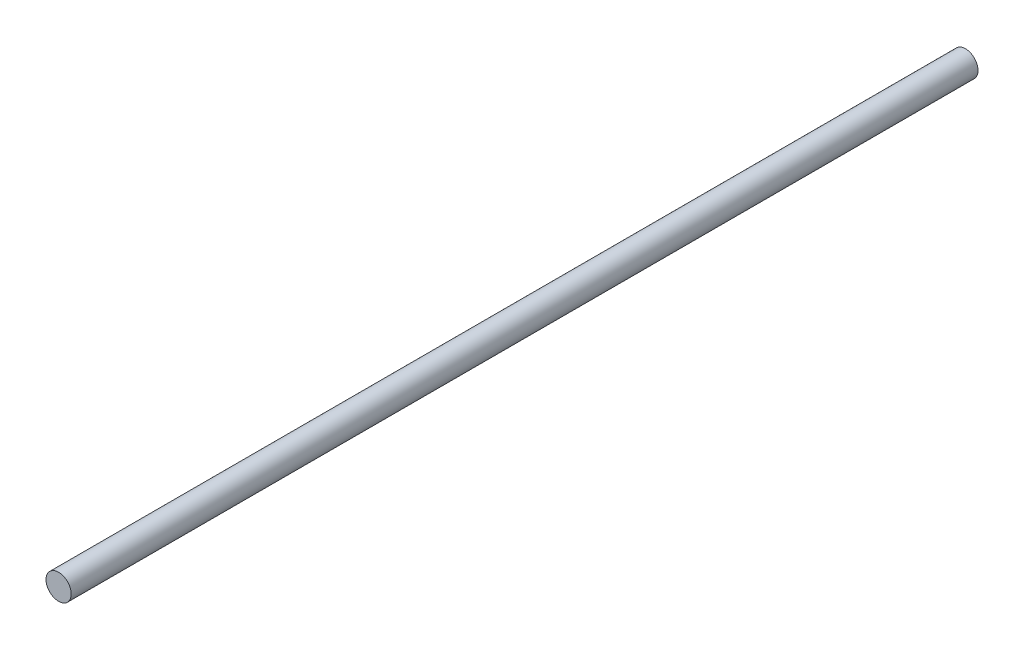
ISO-10303-21;
HEADER;
FILE_DESCRIPTION(('STEP AP214'),'2;1');
FILE_NAME('part.step','',(''),(''),'','','');
FILE_SCHEMA(('AUTOMOTIVE_DESIGN { 1 0 10303 214 1 1 1 1 }'));
ENDSEC;
DATA;
#1=APPLICATION_CONTEXT('core data for automotive mechanical design processes');
#2=APPLICATION_PROTOCOL_DEFINITION('international standard','automotive_design',2000,#1);
#3=PRODUCT_CONTEXT('',#1,'mechanical');
#4=PRODUCT('Part','Part','',(#3));
#5=PRODUCT_RELATED_PRODUCT_CATEGORY('part','',(#4));
#6=PRODUCT_DEFINITION_FORMATION('','',#4);
#7=PRODUCT_DEFINITION_CONTEXT('part definition',#1,'design');
#8=PRODUCT_DEFINITION('design','',#6,#7);
#9=PRODUCT_DEFINITION_SHAPE('','',#8);
#10=(LENGTH_UNIT() NAMED_UNIT(*) SI_UNIT(.MILLI.,.METRE.));
#11=(NAMED_UNIT(*) PLANE_ANGLE_UNIT() SI_UNIT($,.RADIAN.));
#12=(NAMED_UNIT(*) SI_UNIT($,.STERADIAN.) SOLID_ANGLE_UNIT());
#13=UNCERTAINTY_MEASURE_WITH_UNIT(LENGTH_MEASURE(1.E-05),#10,'distance_accuracy_value','');
#14=(GEOMETRIC_REPRESENTATION_CONTEXT(3) GLOBAL_UNCERTAINTY_ASSIGNED_CONTEXT((#13)) GLOBAL_UNIT_ASSIGNED_CONTEXT((#10,
#11,#12)) REPRESENTATION_CONTEXT('',''));
#15=CARTESIAN_POINT('',(0.,0.,0.));
#16=DIRECTION('',(0.,0.,1.));
#17=DIRECTION('',(1.,0.,0.));
#18=AXIS2_PLACEMENT_3D('',#15,#16,#17);
#19=CARTESIAN_POINT('',(0.,0.,360.));
#20=DIRECTION('',(0.,0.,-1.));
#21=DIRECTION('',(-1.,0.,0.));
#22=AXIS2_PLACEMENT_3D('',#19,#20,#21);
#23=CYLINDRICAL_SURFACE('',#22,5.);
#24=CARTESIAN_POINT('',(0.,0.,360.));
#25=DIRECTION('',(0.,0.,1.));
#26=DIRECTION('',(1.,0.,0.));
#27=AXIS2_PLACEMENT_3D('',#24,#25,#26);
#28=CIRCLE('',#27,5.);
#29=CARTESIAN_POINT('',(-5.,0.,360.));
#30=VERTEX_POINT('',#29);
#31=EDGE_CURVE('E10',#30,#30,#28,.T.);
#32=CARTESIAN_POINT('',(0.,0.,0.));
#33=DIRECTION('',(0.,0.,1.));
#34=DIRECTION('',(1.,0.,0.));
#35=AXIS2_PLACEMENT_3D('',#32,#33,#34);
#36=CIRCLE('',#35,5.);
#37=CARTESIAN_POINT('',(-5.,0.,0.));
#38=VERTEX_POINT('',#37);
#39=EDGE_CURVE('E34',#38,#38,#36,.T.);
#40=CARTESIAN_POINT('',(-5.,0.,360.));
#41=CARTESIAN_POINT('',(-5.,0.,356.25));
#42=CARTESIAN_POINT('',(-5.,0.,352.5));
#43=CARTESIAN_POINT('',(-5.,0.,345.));
#44=CARTESIAN_POINT('',(-5.,0.,341.25));
#45=CARTESIAN_POINT('',(-5.,0.,333.75));
#46=CARTESIAN_POINT('',(-5.,0.,330.));
#47=CARTESIAN_POINT('',(-5.,0.,322.5));
#48=CARTESIAN_POINT('',(-5.,0.,318.75));
#49=CARTESIAN_POINT('',(-5.,0.,311.25));
#50=CARTESIAN_POINT('',(-5.,0.,307.5));
#51=CARTESIAN_POINT('',(-5.,0.,300.));
#52=CARTESIAN_POINT('',(-5.,0.,296.25));
#53=CARTESIAN_POINT('',(-5.,0.,288.75));
#54=CARTESIAN_POINT('',(-5.,0.,285.));
#55=CARTESIAN_POINT('',(-5.,0.,277.5));
#56=CARTESIAN_POINT('',(-5.,0.,273.75));
#57=CARTESIAN_POINT('',(-5.,0.,266.25));
#58=CARTESIAN_POINT('',(-5.,0.,262.5));
#59=CARTESIAN_POINT('',(-5.,0.,255.));
#60=CARTESIAN_POINT('',(-5.,0.,251.25));
#61=CARTESIAN_POINT('',(-5.,0.,243.75));
#62=CARTESIAN_POINT('',(-5.,0.,240.));
#63=CARTESIAN_POINT('',(-5.,0.,232.5));
#64=CARTESIAN_POINT('',(-5.,0.,228.75));
#65=CARTESIAN_POINT('',(-5.,0.,221.25));
#66=CARTESIAN_POINT('',(-5.,0.,217.5));
#67=CARTESIAN_POINT('',(-5.,0.,210.));
#68=CARTESIAN_POINT('',(-5.,0.,206.25));
#69=CARTESIAN_POINT('',(-5.,0.,198.75));
#70=CARTESIAN_POINT('',(-5.,0.,195.));
#71=CARTESIAN_POINT('',(-5.,0.,187.5));
#72=CARTESIAN_POINT('',(-5.,0.,183.75));
#73=CARTESIAN_POINT('',(-5.,0.,176.25));
#74=CARTESIAN_POINT('',(-5.,0.,172.5));
#75=CARTESIAN_POINT('',(-5.,0.,165.));
#76=CARTESIAN_POINT('',(-5.,0.,161.25));
#77=CARTESIAN_POINT('',(-5.,0.,153.75));
#78=CARTESIAN_POINT('',(-5.,0.,150.));
#79=CARTESIAN_POINT('',(-5.,0.,142.5));
#80=CARTESIAN_POINT('',(-5.,0.,138.75));
#81=CARTESIAN_POINT('',(-5.,0.,131.25));
#82=CARTESIAN_POINT('',(-5.,0.,127.5));
#83=CARTESIAN_POINT('',(-5.,0.,120.));
#84=CARTESIAN_POINT('',(-5.,0.,116.25));
#85=CARTESIAN_POINT('',(-5.,0.,108.75));
#86=CARTESIAN_POINT('',(-5.,0.,105.));
#87=CARTESIAN_POINT('',(-5.,0.,97.5));
#88=CARTESIAN_POINT('',(-5.,0.,93.75));
#89=CARTESIAN_POINT('',(-5.,0.,86.25));
#90=CARTESIAN_POINT('',(-5.,0.,82.4999999999999));
#91=CARTESIAN_POINT('',(-5.,0.,74.9999999999999));
#92=CARTESIAN_POINT('',(-5.,0.,71.2499999999999));
#93=CARTESIAN_POINT('',(-5.,0.,63.75));
#94=CARTESIAN_POINT('',(-5.,0.,60.));
#95=CARTESIAN_POINT('',(-5.,0.,52.5));
#96=CARTESIAN_POINT('',(-5.,0.,48.7499999999999));
#97=CARTESIAN_POINT('',(-5.,0.,41.2499999999999));
#98=CARTESIAN_POINT('',(-5.,0.,37.4999999999999));
#99=CARTESIAN_POINT('',(-5.,0.,30.));
#100=CARTESIAN_POINT('',(-5.,0.,26.25));
#101=CARTESIAN_POINT('',(-5.,0.,18.75));
#102=CARTESIAN_POINT('',(-5.,0.,14.9999999999999));
#103=CARTESIAN_POINT('',(-5.,0.,7.49999999999993));
#104=CARTESIAN_POINT('',(-5.,0.,3.74999999999994));
#105=CARTESIAN_POINT('',(-5.,0.,0.));
#106=B_SPLINE_CURVE_WITH_KNOTS('',3,(#40,#41,#42,#43,#44,#45,#46,#47,#48,#49,#50,#51,#52,#53,
#54,#55,#56,#57,#58,#59,#60,#61,#62,#63,#64,#65,#66,#67,#68,#69,#70,#71,#72,#73,#74,#75,#76,#77,
#78,#79,#80,#81,#82,#83,#84,#85,#86,#87,#88,#89,#90,#91,#92,#93,#94,#95,#96,#97,#98,#99,#100,
#101,#102,#103,#104,#105),.UNSPECIFIED.,.F.,.F.,(4,2,2,2,2,2,2,2,2,2,2,2,2,2,2,2,2,2,2,2,2,2,2,
2,2,2,2,2,2,2,2,2,4),(0.,11.25,22.5,33.7499999999999,45.,56.25,67.4999999999999,78.75,90.,
101.25,112.5,123.75,135.,146.25,157.5,168.75,180.,191.25,202.5,213.75,225.,236.25,247.5,258.75,
270.,281.25,292.5,303.75,315.,326.25,337.5,348.75,360.),.UNSPECIFIED.);
#107=EDGE_CURVE('BSEAM31',#30,#38,#106,.T.);
#108=ORIENTED_EDGE('',*,*,#31,.F.);
#109=ORIENTED_EDGE('',*,*,#39,.T.);
#110=ORIENTED_EDGE('',*,*,#107,.T.);
#111=ORIENTED_EDGE('',*,*,#107,.F.);
#112=EDGE_LOOP('',(#108,#110,#109,#111));
#113=FACE_BOUND('',#112,.T.);
#114=ADVANCED_FACE('F31',(#113),#23,.T.);
#115=CARTESIAN_POINT('',(0.,0.,360.));
#116=DIRECTION('',(0.,0.,1.));
#117=DIRECTION('',(1.,0.,0.));
#118=AXIS2_PLACEMENT_3D('',#115,#116,#117);
#119=PLANE('',#118);
#120=ORIENTED_EDGE('',*,*,#31,.T.);
#121=EDGE_LOOP('',(#120));
#122=FACE_BOUND('',#121,.T.);
#123=ADVANCED_FACE('F46',(#122),#119,.T.);
#124=CARTESIAN_POINT('',(0.,0.,0.));
#125=DIRECTION('',(0.,0.,1.));
#126=DIRECTION('',(1.,0.,0.));
#127=AXIS2_PLACEMENT_3D('',#124,#125,#126);
#128=PLANE('',#127);
#129=ORIENTED_EDGE('',*,*,#39,.F.);
#130=EDGE_LOOP('',(#129));
#131=FACE_BOUND('',#130,.T.);
#132=ADVANCED_FACE('F44',(#131),#128,.F.);
#133=CLOSED_SHELL('',(#114,#123,#132));
#134=MANIFOLD_SOLID_BREP('B2',#133);
#135=ADVANCED_BREP_SHAPE_REPRESENTATION('',(#18,#134),#14);
#136=SHAPE_DEFINITION_REPRESENTATION(#9,#135);
ENDSEC;
END-ISO-10303-21;
